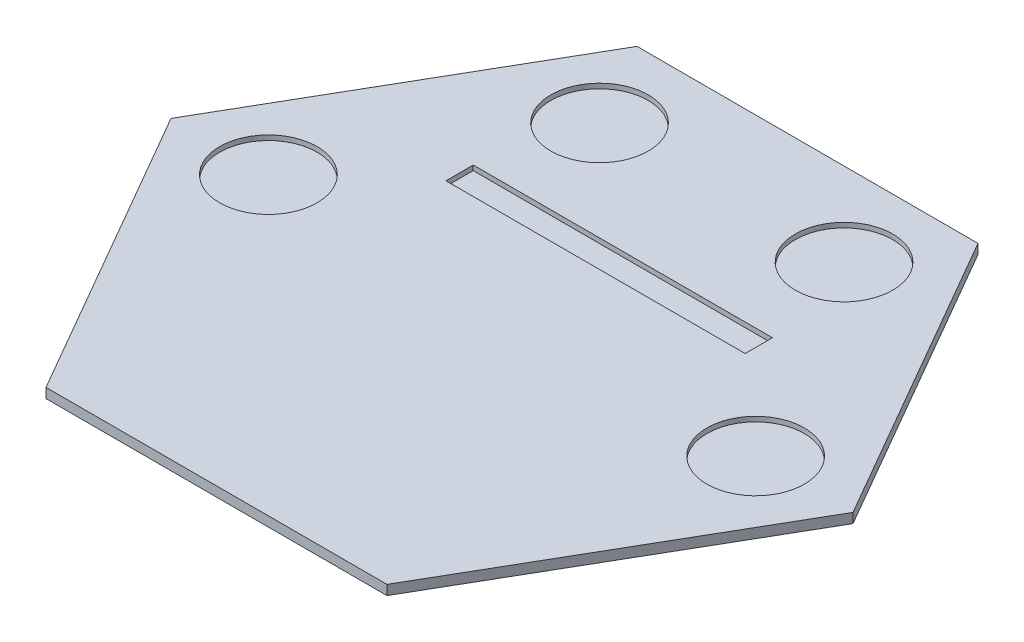
ISO-10303-21;
HEADER;
FILE_DESCRIPTION(('STEP AP214'),'2;1');
FILE_NAME('part.step','',(''),(''),'','','');
FILE_SCHEMA(('AUTOMOTIVE_DESIGN { 1 0 10303 214 1 1 1 1 }'));
ENDSEC;
DATA;
#1=APPLICATION_CONTEXT('core data for automotive mechanical design processes');
#2=APPLICATION_PROTOCOL_DEFINITION('international standard','automotive_design',2000,#1);
#3=PRODUCT_CONTEXT('',#1,'mechanical');
#4=PRODUCT('Part','Part','',(#3));
#5=PRODUCT_RELATED_PRODUCT_CATEGORY('part','',(#4));
#6=PRODUCT_DEFINITION_FORMATION('','',#4);
#7=PRODUCT_DEFINITION_CONTEXT('part definition',#1,'design');
#8=PRODUCT_DEFINITION('design','',#6,#7);
#9=PRODUCT_DEFINITION_SHAPE('','',#8);
#10=(LENGTH_UNIT() NAMED_UNIT(*) SI_UNIT(.MILLI.,.METRE.));
#11=(NAMED_UNIT(*) PLANE_ANGLE_UNIT() SI_UNIT($,.RADIAN.));
#12=(NAMED_UNIT(*) SI_UNIT($,.STERADIAN.) SOLID_ANGLE_UNIT());
#13=UNCERTAINTY_MEASURE_WITH_UNIT(LENGTH_MEASURE(1.E-05),#10,'distance_accuracy_value','');
#14=(GEOMETRIC_REPRESENTATION_CONTEXT(3) GLOBAL_UNCERTAINTY_ASSIGNED_CONTEXT((#13)) GLOBAL_UNIT_ASSIGNED_CONTEXT((#10,
#11,#12)) REPRESENTATION_CONTEXT('',''));
#15=CARTESIAN_POINT('',(0.,0.,0.));
#16=DIRECTION('',(0.,0.,1.));
#17=DIRECTION('',(1.,0.,0.));
#18=AXIS2_PLACEMENT_3D('',#15,#16,#17);
#19=CARTESIAN_POINT('',(349.999980274746,10.,0.117506072211846));
#20=DIRECTION('',(-0.86619322079454,0.,0.499709219696397));
#21=DIRECTION('',(0.499709219696397,0.,0.86619322079454));
#22=AXIS2_PLACEMENT_3D('',#19,#20,#21);
#23=PLANE('',#22);
#24=DIRECTION('',(-0.499709219696397,0.,-0.86619322079454));
#25=VECTOR('',#24,1.);
#26=CARTESIAN_POINT('',(349.999980274746,0.,0.117506072211846));
#27=LINE('',#26,#25);
#28=CARTESIAN_POINT('',(349.999980274746,0.,0.117506072211846));
#29=VERTEX_POINT('',#28);
#30=CARTESIAN_POINT('',(175.101753381008,0.,-303.050121205877));
#31=VERTEX_POINT('',#30);
#32=EDGE_CURVE('E134',#29,#31,#27,.T.);
#33=ORIENTED_EDGE('',*,*,#32,.T.);
#34=DIRECTION('',(0.,-1.,0.));
#35=VECTOR('',#34,1.);
#36=CARTESIAN_POINT('',(175.101753381008,10.,-303.050121205877));
#37=LINE('',#36,#35);
#38=CARTESIAN_POINT('',(175.101753381008,10.,-303.050121205877));
#39=VERTEX_POINT('',#38);
#40=EDGE_CURVE('E11',#39,#31,#37,.T.);
#41=ORIENTED_EDGE('',*,*,#40,.F.);
#42=DIRECTION('',(-0.499709219696397,0.,-0.86619322079454));
#43=VECTOR('',#42,1.);
#44=CARTESIAN_POINT('',(349.999980274746,10.,0.117506072211846));
#45=LINE('',#44,#43);
#46=CARTESIAN_POINT('',(349.999980274746,10.,0.117506072211846));
#47=VERTEX_POINT('',#46);
#48=EDGE_CURVE('E146',#47,#39,#45,.T.);
#49=ORIENTED_EDGE('',*,*,#48,.F.);
#50=DIRECTION('',(0.,-1.,0.));
#51=VECTOR('',#50,1.);
#52=CARTESIAN_POINT('',(349.999980274746,10.,0.117506072211846));
#53=LINE('',#52,#51);
#54=EDGE_CURVE('E130',#47,#29,#53,.T.);
#55=ORIENTED_EDGE('',*,*,#54,.T.);
#56=EDGE_LOOP('',(#33,#41,#49,#55));
#57=FACE_BOUND('',#56,.T.);
#58=ADVANCED_FACE('F38',(#57),#23,.F.);
#59=CARTESIAN_POINT('',(175.101753381008,10.,-303.050121205877));
#60=DIRECTION('',(-0.00033573163489128,0.,0.999999943642133));
#61=DIRECTION('',(0.999999943642133,0.,0.00033573163489128));
#62=AXIS2_PLACEMENT_3D('',#59,#60,#61);
#63=PLANE('',#62);
#64=DIRECTION('',(-0.999999943642133,0.,-0.00033573163489128));
#65=VECTOR('',#64,1.);
#66=CARTESIAN_POINT('',(175.101753381008,0.,-303.050121205877));
#67=LINE('',#66,#65);
#68=CARTESIAN_POINT('',(-174.898226893739,0.,-303.167627278089));
#69=VERTEX_POINT('',#68);
#70=EDGE_CURVE('E137',#31,#69,#67,.T.);
#71=ORIENTED_EDGE('',*,*,#70,.T.);
#72=DIRECTION('',(0.,-1.,0.));
#73=VECTOR('',#72,1.);
#74=CARTESIAN_POINT('',(-174.898226893739,10.,-303.167627278089));
#75=LINE('',#74,#73);
#76=CARTESIAN_POINT('',(-174.898226893739,10.,-303.167627278089));
#77=VERTEX_POINT('',#76);
#78=EDGE_CURVE('E45',#77,#69,#75,.T.);
#79=ORIENTED_EDGE('',*,*,#78,.F.);
#80=DIRECTION('',(-0.999999943642133,0.,-0.00033573163489128));
#81=VECTOR('',#80,1.);
#82=CARTESIAN_POINT('',(175.101753381008,10.,-303.050121205877));
#83=LINE('',#82,#81);
#84=EDGE_CURVE('E96',#39,#77,#83,.T.);
#85=ORIENTED_EDGE('',*,*,#84,.F.);
#86=ORIENTED_EDGE('',*,*,#40,.T.);
#87=EDGE_LOOP('',(#71,#79,#85,#86));
#88=FACE_BOUND('',#87,.T.);
#89=ADVANCED_FACE('F258',(#88),#63,.F.);
#90=CARTESIAN_POINT('',(-174.898226893739,10.,-303.167627278089));
#91=DIRECTION('',(0.865857489159649,0.,0.500290723945736));
#92=DIRECTION('',(0.500290723945736,0.,-0.865857489159649));
#93=AXIS2_PLACEMENT_3D('',#90,#91,#92);
#94=PLANE('',#93);
#95=DIRECTION('',(-0.500290723945736,0.,0.865857489159649));
#96=VECTOR('',#95,1.);
#97=CARTESIAN_POINT('',(-174.898226893739,0.,-303.167627278089));
#98=LINE('',#97,#96);
#99=CARTESIAN_POINT('',(-349.999980274746,0.,-0.117506072211846));
#100=VERTEX_POINT('',#99);
#101=EDGE_CURVE('E140',#69,#100,#98,.T.);
#102=ORIENTED_EDGE('',*,*,#101,.T.);
#103=DIRECTION('',(0.,-1.,0.));
#104=VECTOR('',#103,1.);
#105=CARTESIAN_POINT('',(-349.999980274746,10.,-0.117506072211846));
#106=LINE('',#105,#104);
#107=CARTESIAN_POINT('',(-349.999980274746,10.,-0.117506072211846));
#108=VERTEX_POINT('',#107);
#109=EDGE_CURVE('E125',#108,#100,#106,.T.);
#110=ORIENTED_EDGE('',*,*,#109,.F.);
#111=DIRECTION('',(-0.500290723945736,0.,0.865857489159649));
#112=VECTOR('',#111,1.);
#113=CARTESIAN_POINT('',(-174.898226893739,10.,-303.167627278089));
#114=LINE('',#113,#112);
#115=EDGE_CURVE('E113',#77,#108,#114,.T.);
#116=ORIENTED_EDGE('',*,*,#115,.F.);
#117=ORIENTED_EDGE('',*,*,#78,.T.);
#118=EDGE_LOOP('',(#102,#110,#116,#117));
#119=FACE_BOUND('',#118,.T.);
#120=ADVANCED_FACE('F152',(#119),#94,.F.);
#121=CARTESIAN_POINT('',(-349.999980274746,10.,-0.117506072211846));
#122=DIRECTION('',(0.86619322079454,0.,-0.499709219696397));
#123=DIRECTION('',(-0.499709219696397,0.,-0.86619322079454));
#124=AXIS2_PLACEMENT_3D('',#121,#122,#123);
#125=PLANE('',#124);
#126=DIRECTION('',(0.499709219696397,0.,0.86619322079454));
#127=VECTOR('',#126,1.);
#128=CARTESIAN_POINT('',(-349.999980274746,0.,-0.117506072211846));
#129=LINE('',#128,#127);
#130=CARTESIAN_POINT('',(-175.101753381007,0.,303.050121205877));
#131=VERTEX_POINT('',#130);
#132=EDGE_CURVE('E122',#100,#131,#129,.T.);
#133=ORIENTED_EDGE('',*,*,#132,.T.);
#134=DIRECTION('',(0.,-1.,0.));
#135=VECTOR('',#134,1.);
#136=CARTESIAN_POINT('',(-175.101753381007,10.,303.050121205877));
#137=LINE('',#136,#135);
#138=CARTESIAN_POINT('',(-175.101753381007,10.,303.050121205877));
#139=VERTEX_POINT('',#138);
#140=EDGE_CURVE('E119',#139,#131,#137,.T.);
#141=ORIENTED_EDGE('',*,*,#140,.F.);
#142=DIRECTION('',(0.499709219696397,0.,0.86619322079454));
#143=VECTOR('',#142,1.);
#144=CARTESIAN_POINT('',(-349.999980274746,10.,-0.117506072211846));
#145=LINE('',#144,#143);
#146=EDGE_CURVE('E106',#108,#139,#145,.T.);
#147=ORIENTED_EDGE('',*,*,#146,.F.);
#148=ORIENTED_EDGE('',*,*,#109,.T.);
#149=EDGE_LOOP('',(#133,#141,#147,#148));
#150=FACE_BOUND('',#149,.T.);
#151=ADVANCED_FACE('F120',(#150),#125,.F.);
#152=CARTESIAN_POINT('',(-175.101753381007,10.,303.050121205877));
#153=DIRECTION('',(0.000335731634890963,0.,-0.999999943642133));
#154=DIRECTION('',(-0.999999943642133,0.,-0.000335731634890963));
#155=AXIS2_PLACEMENT_3D('',#152,#153,#154);
#156=PLANE('',#155);
#157=DIRECTION('',(0.999999943642133,0.,0.000335731634890963));
#158=VECTOR('',#157,1.);
#159=CARTESIAN_POINT('',(-175.101753381007,0.,303.050121205877));
#160=LINE('',#159,#158);
#161=CARTESIAN_POINT('',(174.898226893739,0.,303.167627278089));
#162=VERTEX_POINT('',#161);
#163=EDGE_CURVE('E143',#131,#162,#160,.T.);
#164=ORIENTED_EDGE('',*,*,#163,.T.);
#165=DIRECTION('',(0.,-1.,0.));
#166=VECTOR('',#165,1.);
#167=CARTESIAN_POINT('',(174.898226893739,10.,303.167627278089));
#168=LINE('',#167,#166);
#169=CARTESIAN_POINT('',(174.898226893739,10.,303.167627278089));
#170=VERTEX_POINT('',#169);
#171=EDGE_CURVE('E126',#170,#162,#168,.T.);
#172=ORIENTED_EDGE('',*,*,#171,.F.);
#173=DIRECTION('',(0.999999943642133,0.,0.000335731634890963));
#174=VECTOR('',#173,1.);
#175=CARTESIAN_POINT('',(-175.101753381007,10.,303.050121205877));
#176=LINE('',#175,#174);
#177=EDGE_CURVE('E110',#139,#170,#176,.T.);
#178=ORIENTED_EDGE('',*,*,#177,.F.);
#179=ORIENTED_EDGE('',*,*,#140,.T.);
#180=EDGE_LOOP('',(#164,#172,#178,#179));
#181=FACE_BOUND('',#180,.T.);
#182=ADVANCED_FACE('F128',(#181),#156,.F.);
#183=CARTESIAN_POINT('',(174.898226893739,10.,303.167627278089));
#184=DIRECTION('',(-0.865857489159649,0.,-0.500290723945736));
#185=DIRECTION('',(-0.500290723945736,0.,0.865857489159649));
#186=AXIS2_PLACEMENT_3D('',#183,#184,#185);
#187=PLANE('',#186);
#188=DIRECTION('',(0.500290723945736,0.,-0.865857489159649));
#189=VECTOR('',#188,1.);
#190=CARTESIAN_POINT('',(174.898226893739,0.,303.167627278089));
#191=LINE('',#190,#189);
#192=EDGE_CURVE('E88',#162,#29,#191,.T.);
#193=ORIENTED_EDGE('',*,*,#192,.T.);
#194=ORIENTED_EDGE('',*,*,#54,.F.);
#195=DIRECTION('',(0.500290723945736,0.,-0.865857489159649));
#196=VECTOR('',#195,1.);
#197=CARTESIAN_POINT('',(174.898226893739,10.,303.167627278089));
#198=LINE('',#197,#196);
#199=EDGE_CURVE('E61',#170,#47,#198,.T.);
#200=ORIENTED_EDGE('',*,*,#199,.F.);
#201=ORIENTED_EDGE('',*,*,#171,.T.);
#202=EDGE_LOOP('',(#193,#194,#200,#201));
#203=FACE_BOUND('',#202,.T.);
#204=ADVANCED_FACE('F156',(#203),#187,.F.);
#205=CARTESIAN_POINT('',(0.,10.,0.));
#206=DIRECTION('',(0.,1.,0.));
#207=DIRECTION('',(0.,0.,1.));
#208=AXIS2_PLACEMENT_3D('',#205,#206,#207);
#209=PLANE('',#208);
#210=DIRECTION('',(0.,0.,-1.));
#211=VECTOR('',#210,1.);
#212=CARTESIAN_POINT('',(153.5,10.,-85.7175081677937));
#213=LINE('',#212,#211);
#214=CARTESIAN_POINT('',(153.5,10.,-85.7175081677937));
#215=VERTEX_POINT('',#214);
#216=CARTESIAN_POINT('',(153.5,10.,-113.717508167794));
#217=VERTEX_POINT('',#216);
#218=EDGE_CURVE('E52',#215,#217,#213,.T.);
#219=ORIENTED_EDGE('',*,*,#218,.F.);
#220=DIRECTION('',(1.,0.,0.));
#221=VECTOR('',#220,1.);
#222=CARTESIAN_POINT('',(-153.5,10.,-85.7175081677937));
#223=LINE('',#222,#221);
#224=CARTESIAN_POINT('',(-153.5,10.,-85.7175081677937));
#225=VERTEX_POINT('',#224);
#226=EDGE_CURVE('E197',#225,#215,#223,.T.);
#227=ORIENTED_EDGE('',*,*,#226,.F.);
#228=DIRECTION('',(0.,0.,1.));
#229=VECTOR('',#228,1.);
#230=CARTESIAN_POINT('',(-153.5,10.,-85.7175081677937));
#231=LINE('',#230,#229);
#232=CARTESIAN_POINT('',(-153.5,10.,-113.717508167794));
#233=VERTEX_POINT('',#232);
#234=EDGE_CURVE('E201',#233,#225,#231,.T.);
#235=ORIENTED_EDGE('',*,*,#234,.F.);
#236=DIRECTION('',(-1.,0.,0.));
#237=VECTOR('',#236,1.);
#238=CARTESIAN_POINT('',(-153.5,10.,-113.717508167794));
#239=LINE('',#238,#237);
#240=EDGE_CURVE('E204',#217,#233,#239,.T.);
#241=ORIENTED_EDGE('',*,*,#240,.F.);
#242=EDGE_LOOP('',(#219,#227,#235,#241));
#243=FACE_BOUND('',#242,.T.);
#244=CARTESIAN_POINT('',(-250.000009416955,10.,-0.0411618449697933));
#245=DIRECTION('',(0.,1.,0.));
#246=DIRECTION('',(0.,0.,1.));
#247=AXIS2_PLACEMENT_3D('',#244,#245,#246);
#248=CIRCLE('',#247,50.);
#249=CARTESIAN_POINT('',(-250.000009416955,10.,49.9588381550302));
#250=VERTEX_POINT('',#249);
#251=EDGE_CURVE('E182',#250,#250,#248,.T.);
#252=ORIENTED_EDGE('',*,*,#251,.F.);
#253=EDGE_LOOP('',(#252));
#254=FACE_BOUND('',#253,.T.);
#255=CARTESIAN_POINT('',(-126.076603065598,10.,-215.895357645728));
#256=DIRECTION('',(0.,1.,0.));
#257=DIRECTION('',(0.,0.,1.));
#258=AXIS2_PLACEMENT_3D('',#255,#256,#257);
#259=CIRCLE('',#258,50.);
#260=CARTESIAN_POINT('',(-126.076603065598,10.,-165.895357645728));
#261=VERTEX_POINT('',#260);
#262=EDGE_CURVE('E179',#261,#261,#259,.T.);
#263=ORIENTED_EDGE('',*,*,#262,.F.);
#264=EDGE_LOOP('',(#263));
#265=FACE_BOUND('',#264,.T.);
#266=CARTESIAN_POINT('',(122.996764387359,10.,-217.69749897333));
#267=DIRECTION('',(0.,1.,0.));
#268=DIRECTION('',(0.,0.,1.));
#269=AXIS2_PLACEMENT_3D('',#266,#267,#268);
#270=CIRCLE('',#269,50.);
#271=CARTESIAN_POINT('',(122.996764387359,10.,-167.69749897333));
#272=VERTEX_POINT('',#271);
#273=EDGE_CURVE('E173',#272,#272,#270,.T.);
#274=ORIENTED_EDGE('',*,*,#273,.F.);
#275=EDGE_LOOP('',(#274));
#276=FACE_BOUND('',#275,.T.);
#277=CARTESIAN_POINT('',(249.999980274746,10.,0.));
#278=DIRECTION('',(0.,1.,0.));
#279=DIRECTION('',(0.,0.,1.));
#280=AXIS2_PLACEMENT_3D('',#277,#278,#279);
#281=CIRCLE('',#280,50.);
#282=CARTESIAN_POINT('',(249.999980274746,10.,50.));
#283=VERTEX_POINT('',#282);
#284=EDGE_CURVE('E166',#283,#283,#281,.T.);
#285=ORIENTED_EDGE('',*,*,#284,.F.);
#286=EDGE_LOOP('',(#285));
#287=FACE_BOUND('',#286,.T.);
#288=ORIENTED_EDGE('',*,*,#48,.T.);
#289=ORIENTED_EDGE('',*,*,#84,.T.);
#290=ORIENTED_EDGE('',*,*,#115,.T.);
#291=ORIENTED_EDGE('',*,*,#146,.T.);
#292=ORIENTED_EDGE('',*,*,#177,.T.);
#293=ORIENTED_EDGE('',*,*,#199,.T.);
#294=EDGE_LOOP('',(#288,#289,#290,#291,#292,#293));
#295=FACE_BOUND('',#294,.T.);
#296=ADVANCED_FACE('F108',(#243,#254,#265,#276,#287,#295),#209,.T.);
#297=CARTESIAN_POINT('',(0.,0.,0.));
#298=DIRECTION('',(0.,1.,0.));
#299=DIRECTION('',(0.,0.,1.));
#300=AXIS2_PLACEMENT_3D('',#297,#298,#299);
#301=PLANE('',#300);
#302=ORIENTED_EDGE('',*,*,#32,.F.);
#303=ORIENTED_EDGE('',*,*,#192,.F.);
#304=ORIENTED_EDGE('',*,*,#163,.F.);
#305=ORIENTED_EDGE('',*,*,#132,.F.);
#306=ORIENTED_EDGE('',*,*,#101,.F.);
#307=ORIENTED_EDGE('',*,*,#70,.F.);
#308=EDGE_LOOP('',(#302,#303,#304,#305,#306,#307));
#309=FACE_BOUND('',#308,.T.);
#310=ADVANCED_FACE('F155',(#309),#301,.F.);
#311=CARTESIAN_POINT('',(249.999980274746,5.,0.));
#312=DIRECTION('',(0.,1.,0.));
#313=DIRECTION('',(0.,0.,1.));
#314=AXIS2_PLACEMENT_3D('',#311,#312,#313);
#315=CYLINDRICAL_SURFACE('',#314,50.);
#316=CARTESIAN_POINT('',(249.999980274746,5.,0.));
#317=DIRECTION('',(0.,1.,0.));
#318=DIRECTION('',(0.,0.,1.));
#319=AXIS2_PLACEMENT_3D('',#316,#317,#318);
#320=CIRCLE('',#319,50.);
#321=CARTESIAN_POINT('',(249.999980274746,5.,50.));
#322=VERTEX_POINT('',#321);
#323=EDGE_CURVE('E163',#322,#322,#320,.T.);
#324=ORIENTED_EDGE('',*,*,#323,.F.);
#325=EDGE_LOOP('',(#324));
#326=FACE_BOUND('',#325,.T.);
#327=ORIENTED_EDGE('',*,*,#284,.T.);
#328=EDGE_LOOP('',(#327));
#329=FACE_BOUND('',#328,.T.);
#330=ADVANCED_FACE('F275',(#326,#329),#315,.F.);
#331=CARTESIAN_POINT('',(249.999980274746,5.,0.));
#332=DIRECTION('',(0.,1.,0.));
#333=DIRECTION('',(0.,0.,1.));
#334=AXIS2_PLACEMENT_3D('',#331,#332,#333);
#335=PLANE('',#334);
#336=ORIENTED_EDGE('',*,*,#323,.T.);
#337=EDGE_LOOP('',(#336));
#338=FACE_BOUND('',#337,.T.);
#339=ADVANCED_FACE('F278',(#338),#335,.T.);
#340=CARTESIAN_POINT('',(122.996764387359,5.,-217.69749897333));
#341=DIRECTION('',(0.,1.,0.));
#342=DIRECTION('',(0.,0.,1.));
#343=AXIS2_PLACEMENT_3D('',#340,#341,#342);
#344=CYLINDRICAL_SURFACE('',#343,50.);
#345=CARTESIAN_POINT('',(122.996764387359,5.,-217.69749897333));
#346=DIRECTION('',(0.,1.,0.));
#347=DIRECTION('',(0.,0.,1.));
#348=AXIS2_PLACEMENT_3D('',#345,#346,#347);
#349=CIRCLE('',#348,50.);
#350=CARTESIAN_POINT('',(122.996764387359,5.,-167.69749897333));
#351=VERTEX_POINT('',#350);
#352=EDGE_CURVE('E170',#351,#351,#349,.T.);
#353=ORIENTED_EDGE('',*,*,#352,.F.);
#354=EDGE_LOOP('',(#353));
#355=FACE_BOUND('',#354,.T.);
#356=ORIENTED_EDGE('',*,*,#273,.T.);
#357=EDGE_LOOP('',(#356));
#358=FACE_BOUND('',#357,.T.);
#359=ADVANCED_FACE('F281',(#355,#358),#344,.F.);
#360=CARTESIAN_POINT('',(122.996764387359,5.,-217.69749897333));
#361=DIRECTION('',(0.,1.,0.));
#362=DIRECTION('',(0.,0.,1.));
#363=AXIS2_PLACEMENT_3D('',#360,#361,#362);
#364=PLANE('',#363);
#365=ORIENTED_EDGE('',*,*,#352,.T.);
#366=EDGE_LOOP('',(#365));
#367=FACE_BOUND('',#366,.T.);
#368=ADVANCED_FACE('F286',(#367),#364,.T.);
#369=CARTESIAN_POINT('',(-126.076603065598,5.,-215.895357645728));
#370=DIRECTION('',(0.,1.,0.));
#371=DIRECTION('',(0.,0.,1.));
#372=AXIS2_PLACEMENT_3D('',#369,#370,#371);
#373=CYLINDRICAL_SURFACE('',#372,50.);
#374=CARTESIAN_POINT('',(-126.076603065598,5.,-215.895357645728));
#375=DIRECTION('',(0.,1.,0.));
#376=DIRECTION('',(0.,0.,1.));
#377=AXIS2_PLACEMENT_3D('',#374,#375,#376);
#378=CIRCLE('',#377,50.);
#379=CARTESIAN_POINT('',(-126.076603065598,5.,-165.895357645728));
#380=VERTEX_POINT('',#379);
#381=EDGE_CURVE('E176',#380,#380,#378,.T.);
#382=ORIENTED_EDGE('',*,*,#381,.F.);
#383=EDGE_LOOP('',(#382));
#384=FACE_BOUND('',#383,.T.);
#385=ORIENTED_EDGE('',*,*,#262,.T.);
#386=EDGE_LOOP('',(#385));
#387=FACE_BOUND('',#386,.T.);
#388=ADVANCED_FACE('F289',(#384,#387),#373,.F.);
#389=CARTESIAN_POINT('',(-126.076603065598,5.,-215.895357645728));
#390=DIRECTION('',(0.,1.,0.));
#391=DIRECTION('',(0.,0.,1.));
#392=AXIS2_PLACEMENT_3D('',#389,#390,#391);
#393=PLANE('',#392);
#394=ORIENTED_EDGE('',*,*,#381,.T.);
#395=EDGE_LOOP('',(#394));
#396=FACE_BOUND('',#395,.T.);
#397=ADVANCED_FACE('F294',(#396),#393,.T.);
#398=CARTESIAN_POINT('',(-250.000009416955,5.,-0.0411618449697933));
#399=DIRECTION('',(0.,1.,0.));
#400=DIRECTION('',(0.,0.,1.));
#401=AXIS2_PLACEMENT_3D('',#398,#399,#400);
#402=CYLINDRICAL_SURFACE('',#401,50.);
#403=CARTESIAN_POINT('',(-250.000009416955,5.,-0.0411618449697933));
#404=DIRECTION('',(0.,1.,0.));
#405=DIRECTION('',(0.,0.,1.));
#406=AXIS2_PLACEMENT_3D('',#403,#404,#405);
#407=CIRCLE('',#406,50.);
#408=CARTESIAN_POINT('',(-250.000009416955,5.,49.9588381550302));
#409=VERTEX_POINT('',#408);
#410=EDGE_CURVE('E138',#409,#409,#407,.T.);
#411=ORIENTED_EDGE('',*,*,#410,.F.);
#412=EDGE_LOOP('',(#411));
#413=FACE_BOUND('',#412,.T.);
#414=ORIENTED_EDGE('',*,*,#251,.T.);
#415=EDGE_LOOP('',(#414));
#416=FACE_BOUND('',#415,.T.);
#417=ADVANCED_FACE('F297',(#413,#416),#402,.F.);
#418=CARTESIAN_POINT('',(-250.000009416955,5.,-0.0411618449697933));
#419=DIRECTION('',(0.,1.,0.));
#420=DIRECTION('',(0.,0.,1.));
#421=AXIS2_PLACEMENT_3D('',#418,#419,#420);
#422=PLANE('',#421);
#423=ORIENTED_EDGE('',*,*,#410,.T.);
#424=EDGE_LOOP('',(#423));
#425=FACE_BOUND('',#424,.T.);
#426=ADVANCED_FACE('F304',(#425),#422,.T.);
#427=CARTESIAN_POINT('',(153.5,5.,-85.7175081677937));
#428=DIRECTION('',(1.,0.,0.));
#429=DIRECTION('',(0.,0.,-1.));
#430=AXIS2_PLACEMENT_3D('',#427,#428,#429);
#431=PLANE('',#430);
#432=ORIENTED_EDGE('',*,*,#218,.T.);
#433=DIRECTION('',(0.,1.,0.));
#434=VECTOR('',#433,1.);
#435=CARTESIAN_POINT('',(153.5,5.,-113.717508167794));
#436=LINE('',#435,#434);
#437=CARTESIAN_POINT('',(153.5,5.,-113.717508167794));
#438=VERTEX_POINT('',#437);
#439=EDGE_CURVE('E187',#438,#217,#436,.T.);
#440=ORIENTED_EDGE('',*,*,#439,.F.);
#441=DIRECTION('',(0.,0.,-1.));
#442=VECTOR('',#441,1.);
#443=CARTESIAN_POINT('',(153.5,5.,-85.7175081677937));
#444=LINE('',#443,#442);
#445=CARTESIAN_POINT('',(153.5,5.,-85.7175081677937));
#446=VERTEX_POINT('',#445);
#447=EDGE_CURVE('E200',#446,#438,#444,.T.);
#448=ORIENTED_EDGE('',*,*,#447,.F.);
#449=DIRECTION('',(0.,1.,0.));
#450=VECTOR('',#449,1.);
#451=CARTESIAN_POINT('',(153.5,5.,-85.7175081677937));
#452=LINE('',#451,#450);
#453=EDGE_CURVE('E167',#446,#215,#452,.T.);
#454=ORIENTED_EDGE('',*,*,#453,.T.);
#455=EDGE_LOOP('',(#432,#440,#448,#454));
#456=FACE_BOUND('',#455,.T.);
#457=ADVANCED_FACE('F225',(#456),#431,.F.);
#458=CARTESIAN_POINT('',(-153.5,5.,-85.7175081677937));
#459=DIRECTION('',(0.,0.,1.));
#460=DIRECTION('',(1.,0.,0.));
#461=AXIS2_PLACEMENT_3D('',#458,#459,#460);
#462=PLANE('',#461);
#463=ORIENTED_EDGE('',*,*,#226,.T.);
#464=ORIENTED_EDGE('',*,*,#453,.F.);
#465=DIRECTION('',(1.,0.,0.));
#466=VECTOR('',#465,1.);
#467=CARTESIAN_POINT('',(-153.5,5.,-85.7175081677937));
#468=LINE('',#467,#466);
#469=CARTESIAN_POINT('',(-153.5,5.,-85.7175081677937));
#470=VERTEX_POINT('',#469);
#471=EDGE_CURVE('E190',#470,#446,#468,.T.);
#472=ORIENTED_EDGE('',*,*,#471,.F.);
#473=DIRECTION('',(0.,1.,0.));
#474=VECTOR('',#473,1.);
#475=CARTESIAN_POINT('',(-153.5,5.,-85.7175081677937));
#476=LINE('',#475,#474);
#477=EDGE_CURVE('E193',#470,#225,#476,.T.);
#478=ORIENTED_EDGE('',*,*,#477,.T.);
#479=EDGE_LOOP('',(#463,#464,#472,#478));
#480=FACE_BOUND('',#479,.T.);
#481=ADVANCED_FACE('F236',(#480),#462,.F.);
#482=CARTESIAN_POINT('',(-153.5,5.,-85.7175081677937));
#483=DIRECTION('',(-1.,0.,0.));
#484=DIRECTION('',(0.,0.,1.));
#485=AXIS2_PLACEMENT_3D('',#482,#483,#484);
#486=PLANE('',#485);
#487=ORIENTED_EDGE('',*,*,#234,.T.);
#488=ORIENTED_EDGE('',*,*,#477,.F.);
#489=DIRECTION('',(0.,0.,1.));
#490=VECTOR('',#489,1.);
#491=CARTESIAN_POINT('',(-153.5,5.,-85.7175081677937));
#492=LINE('',#491,#490);
#493=CARTESIAN_POINT('',(-153.5,5.,-113.717508167794));
#494=VERTEX_POINT('',#493);
#495=EDGE_CURVE('E210',#494,#470,#492,.T.);
#496=ORIENTED_EDGE('',*,*,#495,.F.);
#497=DIRECTION('',(0.,1.,0.));
#498=VECTOR('',#497,1.);
#499=CARTESIAN_POINT('',(-153.5,5.,-113.717508167794));
#500=LINE('',#499,#498);
#501=EDGE_CURVE('E189',#494,#233,#500,.T.);
#502=ORIENTED_EDGE('',*,*,#501,.T.);
#503=EDGE_LOOP('',(#487,#488,#496,#502));
#504=FACE_BOUND('',#503,.T.);
#505=ADVANCED_FACE('F241',(#504),#486,.F.);
#506=CARTESIAN_POINT('',(-153.5,5.,-113.717508167794));
#507=DIRECTION('',(0.,0.,-1.));
#508=DIRECTION('',(-1.,0.,0.));
#509=AXIS2_PLACEMENT_3D('',#506,#507,#508);
#510=PLANE('',#509);
#511=ORIENTED_EDGE('',*,*,#240,.T.);
#512=ORIENTED_EDGE('',*,*,#501,.F.);
#513=DIRECTION('',(-1.,0.,0.));
#514=VECTOR('',#513,1.);
#515=CARTESIAN_POINT('',(-153.5,5.,-113.717508167794));
#516=LINE('',#515,#514);
#517=EDGE_CURVE('E213',#438,#494,#516,.T.);
#518=ORIENTED_EDGE('',*,*,#517,.F.);
#519=ORIENTED_EDGE('',*,*,#439,.T.);
#520=EDGE_LOOP('',(#511,#512,#518,#519));
#521=FACE_BOUND('',#520,.T.);
#522=ADVANCED_FACE('F247',(#521),#510,.F.);
#523=CARTESIAN_POINT('',(0.,5.,0.));
#524=DIRECTION('',(0.,-1.,0.));
#525=DIRECTION('',(0.,0.,-1.));
#526=AXIS2_PLACEMENT_3D('',#523,#524,#525);
#527=PLANE('',#526);
#528=ORIENTED_EDGE('',*,*,#447,.T.);
#529=ORIENTED_EDGE('',*,*,#517,.T.);
#530=ORIENTED_EDGE('',*,*,#495,.T.);
#531=ORIENTED_EDGE('',*,*,#471,.T.);
#532=EDGE_LOOP('',(#528,#529,#530,#531));
#533=FACE_BOUND('',#532,.T.);
#534=ADVANCED_FACE('F220',(#533),#527,.F.);
#535=CLOSED_SHELL('',(#58,#89,#120,#151,#182,#204,#296,#310,#330,#339,#359,#368,#388,#397,#417,
#426,#457,#481,#505,#522,#534));
#536=MANIFOLD_SOLID_BREP('B2',#535);
#537=ADVANCED_BREP_SHAPE_REPRESENTATION('',(#18,#536),#14);
#538=SHAPE_DEFINITION_REPRESENTATION(#9,#537);
ENDSEC;
END-ISO-10303-21;
